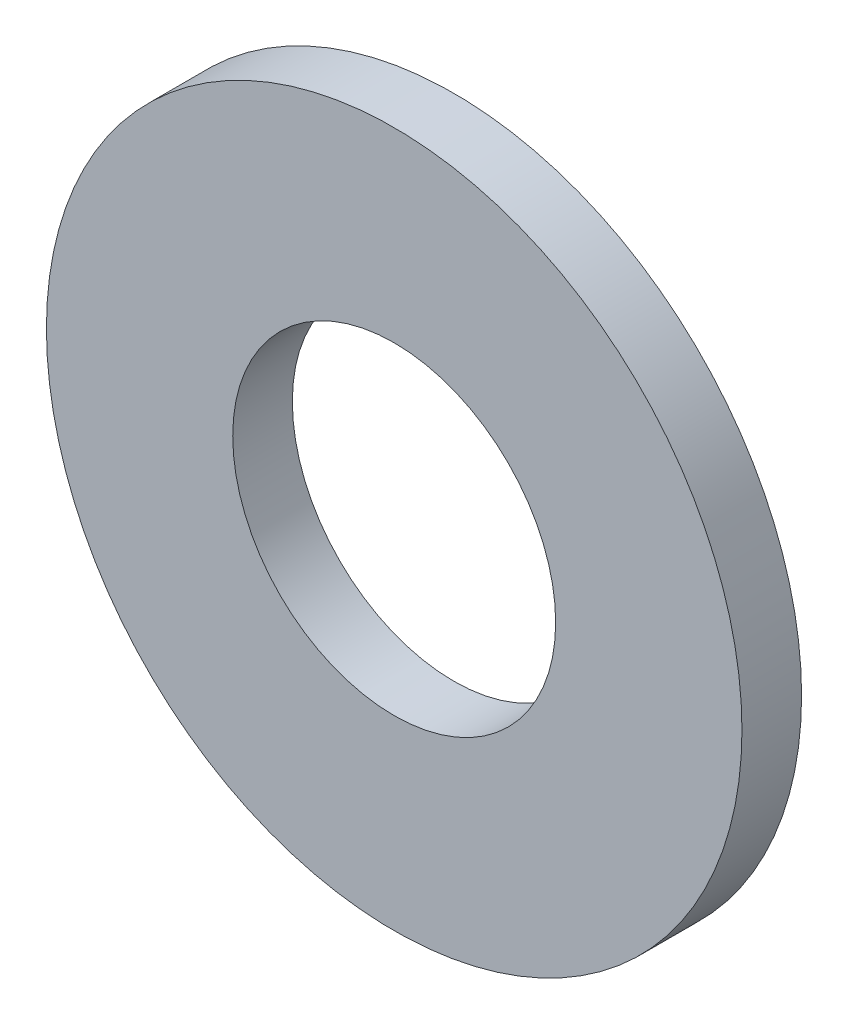
ISO-10303-21;
HEADER;
FILE_DESCRIPTION(('STEP AP214'),'2;1');
FILE_NAME('part.step','',(''),(''),'','','');
FILE_SCHEMA(('AUTOMOTIVE_DESIGN { 1 0 10303 214 1 1 1 1 }'));
ENDSEC;
DATA;
#1=APPLICATION_CONTEXT('core data for automotive mechanical design processes');
#2=APPLICATION_PROTOCOL_DEFINITION('international standard','automotive_design',2000,#1);
#3=PRODUCT_CONTEXT('',#1,'mechanical');
#4=PRODUCT('Part','Part','',(#3));
#5=PRODUCT_RELATED_PRODUCT_CATEGORY('part','',(#4));
#6=PRODUCT_DEFINITION_FORMATION('','',#4);
#7=PRODUCT_DEFINITION_CONTEXT('part definition',#1,'design');
#8=PRODUCT_DEFINITION('design','',#6,#7);
#9=PRODUCT_DEFINITION_SHAPE('','',#8);
#10=(LENGTH_UNIT() NAMED_UNIT(*) SI_UNIT(.MILLI.,.METRE.));
#11=(NAMED_UNIT(*) PLANE_ANGLE_UNIT() SI_UNIT($,.RADIAN.));
#12=(NAMED_UNIT(*) SI_UNIT($,.STERADIAN.) SOLID_ANGLE_UNIT());
#13=UNCERTAINTY_MEASURE_WITH_UNIT(LENGTH_MEASURE(1.E-05),#10,'distance_accuracy_value','');
#14=(GEOMETRIC_REPRESENTATION_CONTEXT(3) GLOBAL_UNCERTAINTY_ASSIGNED_CONTEXT((#13)) GLOBAL_UNIT_ASSIGNED_CONTEXT((#10,
#11,#12)) REPRESENTATION_CONTEXT('',''));
#15=CARTESIAN_POINT('',(0.,0.,0.));
#16=DIRECTION('',(0.,0.,1.));
#17=DIRECTION('',(1.,0.,0.));
#18=AXIS2_PLACEMENT_3D('',#15,#16,#17);
#19=CARTESIAN_POINT('',(0.,0.,1.2));
#20=DIRECTION('',(0.,0.,-1.));
#21=DIRECTION('',(-1.,0.,0.));
#22=AXIS2_PLACEMENT_3D('',#19,#20,#21);
#23=CYLINDRICAL_SURFACE('',#22,3.25);
#24=CARTESIAN_POINT('',(0.,0.,1.2));
#25=DIRECTION('',(0.,0.,-1.));
#26=DIRECTION('',(1.,0.,0.));
#27=AXIS2_PLACEMENT_3D('',#24,#25,#26);
#28=CIRCLE('',#27,3.25);
#29=CARTESIAN_POINT('',(3.24999999999994,0.,1.2));
#30=VERTEX_POINT('',#29);
#31=EDGE_CURVE('E10',#30,#30,#28,.T.);
#32=ORIENTED_EDGE('',*,*,#31,.F.);
#33=EDGE_LOOP('',(#32));
#34=FACE_BOUND('',#33,.T.);
#35=CARTESIAN_POINT('',(0.,0.,0.));
#36=DIRECTION('',(0.,0.,-1.));
#37=DIRECTION('',(1.,0.,0.));
#38=AXIS2_PLACEMENT_3D('',#35,#36,#37);
#39=CIRCLE('',#38,3.25);
#40=CARTESIAN_POINT('',(3.24999999999994,0.,0.));
#41=VERTEX_POINT('',#40);
#42=EDGE_CURVE('E25',#41,#41,#39,.T.);
#43=ORIENTED_EDGE('',*,*,#42,.T.);
#44=EDGE_LOOP('',(#43));
#45=FACE_BOUND('',#44,.T.);
#46=ADVANCED_FACE('F14',(#34,#45),#23,.F.);
#47=CARTESIAN_POINT('',(0.,0.,1.2));
#48=DIRECTION('',(0.,0.,-1.));
#49=DIRECTION('',(-1.,0.,0.));
#50=AXIS2_PLACEMENT_3D('',#47,#48,#49);
#51=CYLINDRICAL_SURFACE('',#50,7.);
#52=CARTESIAN_POINT('',(0.,0.,1.2));
#53=DIRECTION('',(0.,0.,-1.));
#54=DIRECTION('',(1.,0.,0.));
#55=AXIS2_PLACEMENT_3D('',#52,#53,#54);
#56=CIRCLE('',#55,7.);
#57=CARTESIAN_POINT('',(6.99999999999994,0.,1.2));
#58=VERTEX_POINT('',#57);
#59=EDGE_CURVE('E21',#58,#58,#56,.T.);
#60=ORIENTED_EDGE('',*,*,#59,.T.);
#61=EDGE_LOOP('',(#60));
#62=FACE_BOUND('',#61,.T.);
#63=CARTESIAN_POINT('',(0.,0.,0.));
#64=DIRECTION('',(0.,0.,-1.));
#65=DIRECTION('',(1.,0.,0.));
#66=AXIS2_PLACEMENT_3D('',#63,#64,#65);
#67=CIRCLE('',#66,7.);
#68=CARTESIAN_POINT('',(6.99999999999994,0.,0.));
#69=VERTEX_POINT('',#68);
#70=EDGE_CURVE('E30',#69,#69,#67,.T.);
#71=ORIENTED_EDGE('',*,*,#70,.F.);
#72=EDGE_LOOP('',(#71));
#73=FACE_BOUND('',#72,.T.);
#74=ADVANCED_FACE('F16',(#62,#73),#51,.T.);
#75=CARTESIAN_POINT('',(0.,0.,1.2));
#76=DIRECTION('',(0.,0.,-1.));
#77=DIRECTION('',(-1.,0.,0.));
#78=AXIS2_PLACEMENT_3D('',#75,#76,#77);
#79=PLANE('',#78);
#80=ORIENTED_EDGE('',*,*,#31,.T.);
#81=EDGE_LOOP('',(#80));
#82=FACE_BOUND('',#81,.T.);
#83=ORIENTED_EDGE('',*,*,#59,.F.);
#84=EDGE_LOOP('',(#83));
#85=FACE_BOUND('',#84,.T.);
#86=ADVANCED_FACE('F42',(#82,#85),#79,.F.);
#87=CARTESIAN_POINT('',(0.,0.,0.));
#88=DIRECTION('',(0.,0.,-1.));
#89=DIRECTION('',(-1.,0.,0.));
#90=AXIS2_PLACEMENT_3D('',#87,#88,#89);
#91=PLANE('',#90);
#92=ORIENTED_EDGE('',*,*,#42,.F.);
#93=EDGE_LOOP('',(#92));
#94=FACE_BOUND('',#93,.T.);
#95=ORIENTED_EDGE('',*,*,#70,.T.);
#96=EDGE_LOOP('',(#95));
#97=FACE_BOUND('',#96,.T.);
#98=ADVANCED_FACE('F39',(#94,#97),#91,.T.);
#99=CLOSED_SHELL('',(#46,#74,#86,#98));
#100=MANIFOLD_SOLID_BREP('B1',#99);
#101=ADVANCED_BREP_SHAPE_REPRESENTATION('',(#18,#100),#14);
#102=SHAPE_DEFINITION_REPRESENTATION(#9,#101);
ENDSEC;
END-ISO-10303-21;
